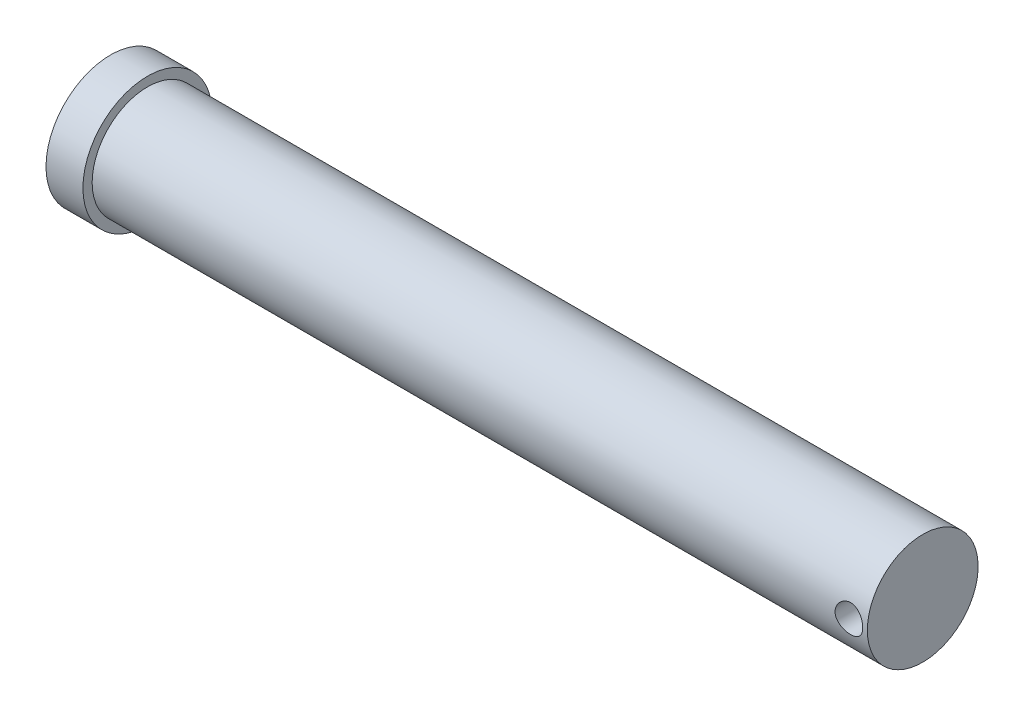
ISO-10303-21;
HEADER;
FILE_DESCRIPTION(('STEP AP214'),'2;1');
FILE_NAME('part.step','',(''),(''),'','','');
FILE_SCHEMA(('AUTOMOTIVE_DESIGN { 1 0 10303 214 1 1 1 1 }'));
ENDSEC;
DATA;
#1=APPLICATION_CONTEXT('core data for automotive mechanical design processes');
#2=APPLICATION_PROTOCOL_DEFINITION('international standard','automotive_design',2000,#1);
#3=PRODUCT_CONTEXT('',#1,'mechanical');
#4=PRODUCT('Part','Part','',(#3));
#5=PRODUCT_RELATED_PRODUCT_CATEGORY('part','',(#4));
#6=PRODUCT_DEFINITION_FORMATION('','',#4);
#7=PRODUCT_DEFINITION_CONTEXT('part definition',#1,'design');
#8=PRODUCT_DEFINITION('design','',#6,#7);
#9=PRODUCT_DEFINITION_SHAPE('','',#8);
#10=(LENGTH_UNIT() NAMED_UNIT(*) SI_UNIT(.MILLI.,.METRE.));
#11=(NAMED_UNIT(*) PLANE_ANGLE_UNIT() SI_UNIT($,.RADIAN.));
#12=(NAMED_UNIT(*) SI_UNIT($,.STERADIAN.) SOLID_ANGLE_UNIT());
#13=UNCERTAINTY_MEASURE_WITH_UNIT(LENGTH_MEASURE(1.E-05),#10,'distance_accuracy_value','');
#14=(GEOMETRIC_REPRESENTATION_CONTEXT(3) GLOBAL_UNCERTAINTY_ASSIGNED_CONTEXT((#13)) GLOBAL_UNIT_ASSIGNED_CONTEXT((#10,
#11,#12)) REPRESENTATION_CONTEXT('',''));
#15=CARTESIAN_POINT('',(0.,0.,0.));
#16=DIRECTION('',(0.,0.,1.));
#17=DIRECTION('',(1.,0.,0.));
#18=AXIS2_PLACEMENT_3D('',#15,#16,#17);
#19=CARTESIAN_POINT('',(0.,0.,0.));
#20=DIRECTION('',(1.,0.,0.));
#21=DIRECTION('',(0.,0.,-1.));
#22=AXIS2_PLACEMENT_3D('',#19,#20,#21);
#23=PLANE('',#22);
#24=CARTESIAN_POINT('',(0.,0.,0.));
#25=DIRECTION('',(-1.,0.,0.));
#26=DIRECTION('',(0.,0.,1.));
#27=AXIS2_PLACEMENT_3D('',#24,#25,#26);
#28=CIRCLE('',#27,35.);
#29=CARTESIAN_POINT('',(0.,0.,35.));
#30=VERTEX_POINT('',#29);
#31=EDGE_CURVE('E45',#30,#30,#28,.T.);
#32=ORIENTED_EDGE('',*,*,#31,.T.);
#33=EDGE_LOOP('',(#32));
#34=FACE_BOUND('',#33,.T.);
#35=ADVANCED_FACE('F30',(#34),#23,.F.);
#36=CARTESIAN_POINT('',(0.,0.,0.));
#37=DIRECTION('',(-1.,0.,0.));
#38=DIRECTION('',(0.,0.,1.));
#39=AXIS2_PLACEMENT_3D('',#36,#37,#38);
#40=CYLINDRICAL_SURFACE('',#39,35.);
#41=ORIENTED_EDGE('',*,*,#31,.F.);
#42=EDGE_LOOP('',(#41));
#43=FACE_BOUND('',#42,.T.);
#44=CARTESIAN_POINT('',(20.,0.,0.));
#45=DIRECTION('',(-1.,0.,0.));
#46=DIRECTION('',(0.,0.,1.));
#47=AXIS2_PLACEMENT_3D('',#44,#45,#46);
#48=CIRCLE('',#47,35.);
#49=CARTESIAN_POINT('',(20.,0.,35.));
#50=VERTEX_POINT('',#49);
#51=EDGE_CURVE('E49',#50,#50,#48,.T.);
#52=ORIENTED_EDGE('',*,*,#51,.T.);
#53=EDGE_LOOP('',(#52));
#54=FACE_BOUND('',#53,.T.);
#55=ADVANCED_FACE('F73',(#43,#54),#40,.T.);
#56=CARTESIAN_POINT('',(20.,35.,0.));
#57=DIRECTION('',(-1.,0.,0.));
#58=DIRECTION('',(0.,0.,1.));
#59=AXIS2_PLACEMENT_3D('',#56,#57,#58);
#60=PLANE('',#59);
#61=ORIENTED_EDGE('',*,*,#51,.F.);
#62=EDGE_LOOP('',(#61));
#63=FACE_BOUND('',#62,.T.);
#64=CARTESIAN_POINT('',(20.,0.,0.));
#65=DIRECTION('',(-1.,0.,0.));
#66=DIRECTION('',(0.,0.,1.));
#67=AXIS2_PLACEMENT_3D('',#64,#65,#66);
#68=CIRCLE('',#67,30.);
#69=CARTESIAN_POINT('',(20.,0.,30.));
#70=VERTEX_POINT('',#69);
#71=EDGE_CURVE('E84',#70,#70,#68,.T.);
#72=ORIENTED_EDGE('',*,*,#71,.T.);
#73=EDGE_LOOP('',(#72));
#74=FACE_BOUND('',#73,.T.);
#75=ADVANCED_FACE('F70',(#63,#74),#60,.F.);
#76=CARTESIAN_POINT('',(0.,0.,0.));
#77=DIRECTION('',(-1.,0.,0.));
#78=DIRECTION('',(0.,0.,1.));
#79=AXIS2_PLACEMENT_3D('',#76,#77,#78);
#80=CYLINDRICAL_SURFACE('',#79,30.);
#81=CARTESIAN_POINT('',(437.5,0.,-30.));
#82=CARTESIAN_POINT('',(437.500006186217,0.207256734254574,-30.0000037453459));
#83=CARTESIAN_POINT('',(437.491407656385,0.414445772619032,-29.9978490421554));
#84=CARTESIAN_POINT('',(437.457100172479,0.827372926875369,-29.9892986338407));
#85=CARTESIAN_POINT('',(437.431389266198,1.0331108745179,-29.9829024448411));
#86=CARTESIAN_POINT('',(437.36305535088,1.44164335288554,-29.9660390935064));
#87=CARTESIAN_POINT('',(437.320427095302,1.6444369502421,-29.9555706682773));
#88=CARTESIAN_POINT('',(437.218595090545,2.04566249050755,-29.9308482104685));
#89=CARTESIAN_POINT('',(437.159385232191,2.2440927967297,-29.9165927827403));
#90=CARTESIAN_POINT('',(437.024978510783,2.63482361033414,-29.8847130121074));
#91=CARTESIAN_POINT('',(436.949807291118,2.82713338772061,-29.8670940775137));
#92=CARTESIAN_POINT('',(436.783968260348,3.20473275040713,-29.8289408904844));
#93=CARTESIAN_POINT('',(436.693294723878,3.39001971101988,-29.8084055614329));
#94=CARTESIAN_POINT('',(436.497171832667,3.75222027556639,-29.7649811811595));
#95=CARTESIAN_POINT('',(436.391727896133,3.92913691827915,-29.742092993849));
#96=CARTESIAN_POINT('',(436.166735936979,4.27360568159023,-29.6945540671174));
#97=CARTESIAN_POINT('',(436.047182537647,4.44115419618484,-29.6699026572012));
#98=CARTESIAN_POINT('',(435.792523081933,4.76869838853698,-29.619039181262));
#99=CARTESIAN_POINT('',(435.657174907785,4.92850273427093,-29.5928069564233));
#100=CARTESIAN_POINT('',(435.373571351917,5.23627158512015,-29.5399027992388));
#101=CARTESIAN_POINT('',(435.225310108959,5.38423065457484,-29.5132306717209));
#102=CARTESIAN_POINT('',(434.916888160703,5.66727667516601,-29.4601886439759));
#103=CARTESIAN_POINT('',(434.756726097413,5.80236215327963,-29.4338187786372));
#104=CARTESIAN_POINT('',(434.425632772002,6.05867850940972,-29.3821290110363));
#105=CARTESIAN_POINT('',(434.254706399365,6.1799156083703,-29.3568086406046));
#106=CARTESIAN_POINT('',(433.900431237845,6.40951409930151,-29.3075439341613));
#107=CARTESIAN_POINT('',(433.716932176899,6.51764960185278,-29.2836266449605));
#108=CARTESIAN_POINT('',(433.341230118986,6.71799715274033,-29.2383150093389));
#109=CARTESIAN_POINT('',(433.149030545994,6.81021539751506,-29.2169196821753));
#110=CARTESIAN_POINT('',(432.757145068967,6.97807998690057,-29.1772830300449));
#111=CARTESIAN_POINT('',(432.557457135497,7.05372180053084,-29.1590425677112));
#112=CARTESIAN_POINT('',(432.152161449931,7.1877490781954,-29.1262944152227));
#113=CARTESIAN_POINT('',(431.946556194448,7.24614170611684,-29.111785175751));
#114=CARTESIAN_POINT('',(431.534958657447,7.34423429783448,-29.087191868454));
#115=CARTESIAN_POINT('',(431.329053396646,7.3842790777465,-29.0770264361312));
#116=CARTESIAN_POINT('',(430.914524296797,7.44698381998103,-29.0610302983691));
#117=CARTESIAN_POINT('',(430.705901540208,7.46965050140471,-29.0551979176174));
#118=CARTESIAN_POINT('',(430.287403528923,7.4974248655388,-29.0480434288025));
#119=CARTESIAN_POINT('',(430.077528217797,7.50253175108483,-29.0467215255021));
#120=CARTESIAN_POINT('',(429.658110384037,7.49513850303138,-29.0486301556068));
#121=CARTESIAN_POINT('',(429.448567856817,7.48263861425262,-29.0518606257116));
#122=CARTESIAN_POINT('',(429.036489209476,7.44066443989573,-29.0626386537169));
#123=CARTESIAN_POINT('',(428.833907059313,7.4116127135399,-29.0700787116682));
#124=CARTESIAN_POINT('',(428.431905166734,7.33708950806225,-29.0889771849314));
#125=CARTESIAN_POINT('',(428.232486535232,7.29161238858818,-29.1004369805509));
#126=CARTESIAN_POINT('',(427.838319690164,7.18462456321622,-29.1270356051467));
#127=CARTESIAN_POINT('',(427.643570038699,7.12311886472078,-29.1421732850352));
#128=CARTESIAN_POINT('',(427.259908488116,6.98451980658927,-29.1757016001342));
#129=CARTESIAN_POINT('',(427.070998807608,6.90742060486374,-29.1940934541936));
#130=CARTESIAN_POINT('',(426.69851839304,6.73739848582151,-29.2338015327733));
#131=CARTESIAN_POINT('',(426.515017414975,6.64432902465888,-29.2551444484012));
#132=CARTESIAN_POINT('',(426.156419006921,6.44353389820847,-29.3000247863839));
#133=CARTESIAN_POINT('',(425.981324498638,6.33580318651136,-29.3235629634671));
#134=CARTESIAN_POINT('',(425.640714884194,6.10645448231138,-29.3721798477543));
#135=CARTESIAN_POINT('',(425.475199544114,5.98483682913734,-29.3972585173093));
#136=CARTESIAN_POINT('',(425.154773921606,5.72851464458563,-29.4482799478748));
#137=CARTESIAN_POINT('',(424.999863844413,5.59380986006436,-29.4742227255933));
#138=CARTESIAN_POINT('',(424.697330574703,5.30812720402336,-29.5270296746379));
#139=CARTESIAN_POINT('',(424.550044476872,5.15679305825285,-29.5538989083984));
#140=CARTESIAN_POINT('',(424.268755446213,4.8422451377086,-29.6070614891839));
#141=CARTESIAN_POINT('',(424.134748122933,4.67903532063278,-29.633355024301));
#142=CARTESIAN_POINT('',(423.88082948277,4.34169745900449,-29.6846555639648));
#143=CARTESIAN_POINT('',(423.760923905518,4.16756501268236,-29.7096620423464));
#144=CARTESIAN_POINT('',(423.536173056712,3.80966849400542,-29.7576713903058));
#145=CARTESIAN_POINT('',(423.431321967214,3.62590818010508,-29.7806750325377));
#146=CARTESIAN_POINT('',(423.237034272838,3.24921184124929,-29.8241295151946));
#147=CARTESIAN_POINT('',(423.147658542865,3.05624322556215,-29.8445701905708));
#148=CARTESIAN_POINT('',(422.985552498738,2.6632116427314,-29.8822063507743));
#149=CARTESIAN_POINT('',(422.912816015972,2.46315133653782,-29.8994030378182));
#150=CARTESIAN_POINT('',(422.784544100766,2.05730133669797,-29.9300671893901));
#151=CARTESIAN_POINT('',(422.729009232108,1.85151145550624,-29.9435345316876));
#152=CARTESIAN_POINT('',(422.635622134414,1.43573434643275,-29.9663479171876));
#153=CARTESIAN_POINT('',(422.597769469432,1.22574722216535,-29.9756940619961));
#154=CARTESIAN_POINT('',(422.540819163691,0.808578683807361,-29.9898089145492));
#155=CARTESIAN_POINT('',(422.521266127366,0.601463095698461,-29.9946886976466));
#156=CARTESIAN_POINT('',(422.499432162322,0.186267995157771,-30.0001400772457));
#157=CARTESIAN_POINT('',(422.497150960436,-0.0218115019769025,-30.000711741884));
#158=CARTESIAN_POINT('',(422.50987953381,-0.437389325214032,-29.9975310207239));
#159=CARTESIAN_POINT('',(422.524887864681,-0.644887698412749,-29.9937789961322));
#160=CARTESIAN_POINT('',(422.572063941794,-1.05780268491358,-29.9820565166686));
#161=CARTESIAN_POINT('',(422.604231620946,-1.26321930635195,-29.9740860782903));
#162=CARTESIAN_POINT('',(422.684842366611,-1.66742320422338,-29.9542990466074));
#163=CARTESIAN_POINT('',(422.733033584068,-1.86626371494321,-29.9425420528386));
#164=CARTESIAN_POINT('',(422.845432070167,-2.25918742632009,-29.9154620308896));
#165=CARTESIAN_POINT('',(422.909644760804,-2.45326899198191,-29.9001377955995));
#166=CARTESIAN_POINT('',(423.05356225007,-2.83525089394273,-29.8663374011303));
#167=CARTESIAN_POINT('',(423.133262697368,-3.02315294909719,-29.8478621274231));
#168=CARTESIAN_POINT('',(423.307610064188,-3.39167896910059,-29.8082350586212));
#169=CARTESIAN_POINT('',(423.402262583514,-3.57230017520982,-29.7870822613409));
#170=CARTESIAN_POINT('',(423.607595070583,-3.92811410360475,-29.7422701230095));
#171=CARTESIAN_POINT('',(423.718525064136,-4.10315786453241,-29.7185735994032));
#172=CARTESIAN_POINT('',(423.954405866344,-4.44338343365204,-29.6696123625192));
#173=CARTESIAN_POINT('',(424.07936153279,-4.60856179442648,-29.6443471072734));
#174=CARTESIAN_POINT('',(424.342420940197,-4.92794065130355,-29.5929310301235));
#175=CARTESIAN_POINT('',(424.480524460526,-5.08214133154532,-29.5667802230845));
#176=CARTESIAN_POINT('',(424.76898239741,-5.37858986672454,-29.5142920657744));
#177=CARTESIAN_POINT('',(424.919336952682,-5.52083758628274,-29.4879547133943));
#178=CARTESIAN_POINT('',(425.235205576479,-5.79583124003958,-29.4351563606738));
#179=CARTESIAN_POINT('',(425.401002867936,-5.92825459803295,-29.4087084526847));
#180=CARTESIAN_POINT('',(425.743293990939,-6.17862451598173,-29.3571275246933));
#181=CARTESIAN_POINT('',(425.919784122681,-6.2965760410501,-29.3319940554304));
#182=CARTESIAN_POINT('',(426.282397387657,-6.51724566861916,-29.2837544538572));
#183=CARTESIAN_POINT('',(426.468523885388,-6.61995840151208,-29.2606490373261));
#184=CARTESIAN_POINT('',(426.849007741884,-6.80928641924754,-29.2171705487862));
#185=CARTESIAN_POINT('',(427.043361767825,-6.89590814708463,-29.1967963840713));
#186=CARTESIAN_POINT('',(427.437897915295,-7.05197723932849,-29.1594928518965));
#187=CARTESIAN_POINT('',(427.638041174236,-7.12151832737373,-29.142544780169));
#188=CARTESIAN_POINT('',(428.043683954084,-7.24345651216679,-29.1124764442986));
#189=CARTESIAN_POINT('',(428.249181379846,-7.29586020933087,-29.0993547066657));
#190=CARTESIAN_POINT('',(428.664097517061,-7.38310953761381,-29.0773403452908));
#191=CARTESIAN_POINT('',(428.873516262,-7.41795501871784,-29.0684477576821));
#192=CARTESIAN_POINT('',(429.294693502206,-7.46977632397466,-29.0551744235845));
#193=CARTESIAN_POINT('',(429.506451941057,-7.48675257805307,-29.0507935685455));
#194=CARTESIAN_POINT('',(429.924548037896,-7.50245275501608,-29.0467427280977));
#195=CARTESIAN_POINT('',(430.130865291879,-7.50169050219219,-29.0469401256905));
#196=CARTESIAN_POINT('',(430.542757585411,-7.48317627143568,-29.0517153474306));
#197=CARTESIAN_POINT('',(430.748332344452,-7.46541843430737,-29.0562946822425));
#198=CARTESIAN_POINT('',(431.157102212016,-7.41306667528967,-29.0696950370366));
#199=CARTESIAN_POINT('',(431.360298223325,-7.37847936764756,-29.0785143906083));
#200=CARTESIAN_POINT('',(431.763027411306,-7.29274542738181,-29.1001342961677));
#201=CARTESIAN_POINT('',(431.962559195749,-7.24159263281379,-29.1129363295422));
#202=CARTESIAN_POINT('',(432.355248099114,-7.12352281554545,-29.1420502241293));
#203=CARTESIAN_POINT('',(432.548437627675,-7.05670785633591,-29.1583393045388));
#204=CARTESIAN_POINT('',(432.928538990651,-6.90762983393257,-29.1940151713161));
#205=CARTESIAN_POINT('',(433.115448654799,-6.82536149362097,-29.2134030155311));
#206=CARTESIAN_POINT('',(433.481700975957,-6.64600134575065,-29.2547283332099));
#207=CARTESIAN_POINT('',(433.66104416923,-6.54891059096672,-29.2766656255706));
#208=CARTESIAN_POINT('',(434.011053726098,-6.34057791264133,-29.3224903932774));
#209=CARTESIAN_POINT('',(434.181719851362,-6.2293356006946,-29.3463779221434));
#210=CARTESIAN_POINT('',(434.517676511659,-5.99034243964054,-29.3961065190916));
#211=CARTESIAN_POINT('',(434.682708134733,-5.86223474325165,-29.42198241748));
#212=CARTESIAN_POINT('',(435.001403053256,-5.59280739993016,-29.4743842744133));
#213=CARTESIAN_POINT('',(435.155069946792,-5.45149196693633,-29.5009100236431));
#214=CARTESIAN_POINT('',(435.450186022067,-5.15645532971094,-29.5539073425417));
#215=CARTESIAN_POINT('',(435.591628075764,-5.00272698747202,-29.580378871931));
#216=CARTESIAN_POINT('',(435.861210696173,-4.68398990056899,-29.6325210396486));
#217=CARTESIAN_POINT('',(435.989356069046,-4.51898526780471,-29.6581919649966));
#218=CARTESIAN_POINT('',(436.233778989682,-4.17555233782097,-29.7085076706245));
#219=CARTESIAN_POINT('',(436.349792570839,-3.99693193174419,-29.7331246154161));
#220=CARTESIAN_POINT('',(436.566283371818,-3.63032066972452,-29.7801093561847));
#221=CARTESIAN_POINT('',(436.666766303198,-3.4423332923778,-29.8024779779427));
#222=CARTESIAN_POINT('',(436.851436858964,-3.0582961610557,-29.8443309638024));
#223=CARTESIAN_POINT('',(436.935631507769,-2.86224992693639,-29.8638165703651));
#224=CARTESIAN_POINT('',(437.087082944362,-2.46348752288635,-29.8993536986122));
#225=CARTESIAN_POINT('',(437.154342287269,-2.26077236435612,-29.9154057382819));
#226=CARTESIAN_POINT('',(437.307791067383,-1.72222038090993,-29.9523811960306));
#227=CARTESIAN_POINT('',(437.379744222302,-1.38198934082179,-29.9701268439889));
#228=CARTESIAN_POINT('',(437.475841710173,-0.694441878056045,-29.9939326700618));
#229=CARTESIAN_POINT('',(437.499989638953,-0.347125990274136,-29.9999937270705));
#230=CARTESIAN_POINT('',(437.5,0.,-30.));
#231=B_SPLINE_CURVE_WITH_KNOTS('',3,(#81,#82,#83,#84,#85,#86,#87,#88,#89,#90,#91,#92,#93,#94,
#95,#96,#97,#98,#99,#100,#101,#102,#103,#104,#105,#106,#107,#108,#109,#110,#111,#112,#113,#114,
#115,#116,#117,#118,#119,#120,#121,#122,#123,#124,#125,#126,#127,#128,#129,#130,#131,#132,#133,
#134,#135,#136,#137,#138,#139,#140,#141,#142,#143,#144,#145,#146,#147,#148,#149,#150,#151,#152,
#153,#154,#155,#156,#157,#158,#159,#160,#161,#162,#163,#164,#165,#166,#167,#168,#169,#170,#171,
#172,#173,#174,#175,#176,#177,#178,#179,#180,#181,#182,#183,#184,#185,#186,#187,#188,#189,#190,
#191,#192,#193,#194,#195,#196,#197,#198,#199,#200,#201,#202,#203,#204,#205,#206,#207,#208,#209,
#210,#211,#212,#213,#214,#215,#216,#217,#218,#219,#220,#221,#222,#223,#224,#225,#226,#227,#228,
#229,#230),.UNSPECIFIED.,.T.,.F.,(4,2,2,2,2,2,2,2,2,2,2,2,2,2,2,2,2,2,2,2,2,2,2,2,2,2,2,2,2,2,2,
2,2,2,2,2,2,2,2,2,2,2,2,2,2,2,2,2,2,2,2,2,2,2,2,2,2,2,2,2,2,2,2,2,2,2,2,2,2,2,2,2,2,2,4),(0.,
0.621464317010415,1.24299954382043,1.86472767684075,2.48668517567918,3.10765090273784,
3.72884646419193,4.34981474719269,4.9710204322486,5.60345785394206,6.23618384989137,
6.86898215694612,7.50149507214969,8.14370490718985,8.78566416935039,9.42779868557203,
10.0696661359822,10.6989188565581,11.3279281587942,11.9569660158719,12.5859951263177,
13.1996422302775,13.813500256537,14.4271667401151,15.0410635604956,15.6609283810619,
16.2810071015709,16.9010706736347,17.5211462419403,18.1590318968173,18.7967059344353,
19.4346386236679,20.072324110567,20.7124637031903,21.3523655930574,21.9922884534341,
22.6321955359513,23.2557181786969,23.8792309598844,24.502691655776,25.1261499140133,
25.7402389224971,26.3545360338667,26.9686608054559,27.5830161248213,28.2080518295538,
28.8333046873218,29.4585470546531,30.0837965025262,30.7245311303908,31.3650453114752,
32.0057846536418,32.6462668819265,33.2831519874563,33.9197915088559,34.5564364695181,
35.1930661124366,35.811278334809,36.4297037614805,37.0478863332833,37.666299118085,
38.2807888234883,38.8954887514427,39.5101450400985,40.1248182023237,40.7556352414597,
41.386251700531,42.0172334122504,42.6479862516883,43.2904290553219,43.9326350288529,
44.5745634267957,45.2163949154786,46.2573388715186,47.2982045265631),.UNSPECIFIED.);
#232=CARTESIAN_POINT('',(437.5,0.,-30.));
#233=VERTEX_POINT('',#232);
#234=EDGE_CURVE('E10',#233,#233,#231,.T.);
#235=ORIENTED_EDGE('',*,*,#234,.T.);
#236=EDGE_LOOP('',(#235));
#237=FACE_BOUND('',#236,.T.);
#238=CARTESIAN_POINT('',(437.5,0.,30.));
#239=CARTESIAN_POINT('',(437.500006186217,-0.207256734254574,30.0000037453459));
#240=CARTESIAN_POINT('',(437.491407656385,-0.414445772619032,29.9978490421554));
#241=CARTESIAN_POINT('',(437.457100172479,-0.827372926875369,29.9892986338407));
#242=CARTESIAN_POINT('',(437.431389266198,-1.0331108745179,29.9829024448411));
#243=CARTESIAN_POINT('',(437.36305535088,-1.44164335288554,29.9660390935064));
#244=CARTESIAN_POINT('',(437.320427095302,-1.6444369502421,29.9555706682773));
#245=CARTESIAN_POINT('',(437.218595090545,-2.04566249050755,29.9308482104685));
#246=CARTESIAN_POINT('',(437.159385232191,-2.2440927967297,29.9165927827403));
#247=CARTESIAN_POINT('',(437.024978510783,-2.63482361033414,29.8847130121074));
#248=CARTESIAN_POINT('',(436.949807291118,-2.82713338772061,29.8670940775137));
#249=CARTESIAN_POINT('',(436.783968260348,-3.20473275040713,29.8289408904844));
#250=CARTESIAN_POINT('',(436.693294723878,-3.39001971101988,29.8084055614329));
#251=CARTESIAN_POINT('',(436.497171832667,-3.75222027556639,29.7649811811595));
#252=CARTESIAN_POINT('',(436.391727896133,-3.92913691827915,29.742092993849));
#253=CARTESIAN_POINT('',(436.166735936979,-4.27360568159023,29.6945540671174));
#254=CARTESIAN_POINT('',(436.047182537647,-4.44115419618484,29.6699026572012));
#255=CARTESIAN_POINT('',(435.792523081933,-4.76869838853698,29.619039181262));
#256=CARTESIAN_POINT('',(435.657174907785,-4.92850273427093,29.5928069564233));
#257=CARTESIAN_POINT('',(435.373571351917,-5.23627158512015,29.5399027992388));
#258=CARTESIAN_POINT('',(435.225310108959,-5.38423065457484,29.5132306717209));
#259=CARTESIAN_POINT('',(434.916888160703,-5.66727667516601,29.4601886439759));
#260=CARTESIAN_POINT('',(434.756726097413,-5.80236215327963,29.4338187786372));
#261=CARTESIAN_POINT('',(434.425632772002,-6.05867850940972,29.3821290110363));
#262=CARTESIAN_POINT('',(434.254706399365,-6.1799156083703,29.3568086406046));
#263=CARTESIAN_POINT('',(433.900431237845,-6.40951409930151,29.3075439341613));
#264=CARTESIAN_POINT('',(433.716932176899,-6.51764960185278,29.2836266449605));
#265=CARTESIAN_POINT('',(433.341230118986,-6.71799715274033,29.2383150093389));
#266=CARTESIAN_POINT('',(433.149030545994,-6.81021539751506,29.2169196821753));
#267=CARTESIAN_POINT('',(432.757145068967,-6.97807998690057,29.1772830300449));
#268=CARTESIAN_POINT('',(432.557457135497,-7.05372180053084,29.1590425677112));
#269=CARTESIAN_POINT('',(432.152161449931,-7.1877490781954,29.1262944152227));
#270=CARTESIAN_POINT('',(431.946556194448,-7.24614170611684,29.111785175751));
#271=CARTESIAN_POINT('',(431.534958657447,-7.34423429783448,29.087191868454));
#272=CARTESIAN_POINT('',(431.329053396646,-7.3842790777465,29.0770264361312));
#273=CARTESIAN_POINT('',(430.914524296797,-7.44698381998103,29.0610302983691));
#274=CARTESIAN_POINT('',(430.705901540208,-7.46965050140471,29.0551979176174));
#275=CARTESIAN_POINT('',(430.287403528923,-7.4974248655388,29.0480434288025));
#276=CARTESIAN_POINT('',(430.077528217797,-7.50253175108483,29.0467215255021));
#277=CARTESIAN_POINT('',(429.658110384037,-7.49513850303138,29.0486301556068));
#278=CARTESIAN_POINT('',(429.448567856817,-7.48263861425262,29.0518606257116));
#279=CARTESIAN_POINT('',(429.036489209476,-7.44066443989573,29.0626386537169));
#280=CARTESIAN_POINT('',(428.833907059313,-7.4116127135399,29.0700787116682));
#281=CARTESIAN_POINT('',(428.431905166734,-7.33708950806225,29.0889771849314));
#282=CARTESIAN_POINT('',(428.232486535232,-7.29161238858818,29.1004369805509));
#283=CARTESIAN_POINT('',(427.838319690164,-7.18462456321622,29.1270356051467));
#284=CARTESIAN_POINT('',(427.643570038699,-7.12311886472078,29.1421732850352));
#285=CARTESIAN_POINT('',(427.259908488116,-6.98451980658927,29.1757016001342));
#286=CARTESIAN_POINT('',(427.070998807608,-6.90742060486374,29.1940934541936));
#287=CARTESIAN_POINT('',(426.69851839304,-6.73739848582151,29.2338015327733));
#288=CARTESIAN_POINT('',(426.515017414975,-6.64432902465888,29.2551444484012));
#289=CARTESIAN_POINT('',(426.156419006921,-6.44353389820847,29.3000247863839));
#290=CARTESIAN_POINT('',(425.981324498638,-6.33580318651136,29.3235629634671));
#291=CARTESIAN_POINT('',(425.640714884194,-6.10645448231138,29.3721798477543));
#292=CARTESIAN_POINT('',(425.475199544114,-5.98483682913734,29.3972585173093));
#293=CARTESIAN_POINT('',(425.154773921606,-5.72851464458563,29.4482799478748));
#294=CARTESIAN_POINT('',(424.999863844413,-5.59380986006436,29.4742227255933));
#295=CARTESIAN_POINT('',(424.697330574703,-5.30812720402336,29.5270296746379));
#296=CARTESIAN_POINT('',(424.550044476872,-5.15679305825285,29.5538989083984));
#297=CARTESIAN_POINT('',(424.268755446213,-4.8422451377086,29.6070614891839));
#298=CARTESIAN_POINT('',(424.134748122933,-4.67903532063278,29.633355024301));
#299=CARTESIAN_POINT('',(423.88082948277,-4.34169745900449,29.6846555639648));
#300=CARTESIAN_POINT('',(423.760923905518,-4.16756501268236,29.7096620423464));
#301=CARTESIAN_POINT('',(423.536173056712,-3.80966849400542,29.7576713903058));
#302=CARTESIAN_POINT('',(423.431321967214,-3.62590818010508,29.7806750325377));
#303=CARTESIAN_POINT('',(423.237034272838,-3.24921184124929,29.8241295151946));
#304=CARTESIAN_POINT('',(423.147658542865,-3.05624322556215,29.8445701905708));
#305=CARTESIAN_POINT('',(422.985552498738,-2.6632116427314,29.8822063507743));
#306=CARTESIAN_POINT('',(422.912816015972,-2.46315133653782,29.8994030378182));
#307=CARTESIAN_POINT('',(422.784544100766,-2.05730133669797,29.9300671893901));
#308=CARTESIAN_POINT('',(422.729009232108,-1.85151145550624,29.9435345316876));
#309=CARTESIAN_POINT('',(422.635622134414,-1.43573434643275,29.9663479171876));
#310=CARTESIAN_POINT('',(422.597769469432,-1.22574722216535,29.9756940619961));
#311=CARTESIAN_POINT('',(422.540819163691,-0.808578683807361,29.9898089145492));
#312=CARTESIAN_POINT('',(422.521266127366,-0.601463095698461,29.9946886976466));
#313=CARTESIAN_POINT('',(422.499432162322,-0.186267995157771,30.0001400772457));
#314=CARTESIAN_POINT('',(422.497150960436,0.0218115019769025,30.000711741884));
#315=CARTESIAN_POINT('',(422.50987953381,0.437389325214032,29.9975310207239));
#316=CARTESIAN_POINT('',(422.524887864681,0.644887698412749,29.9937789961322));
#317=CARTESIAN_POINT('',(422.572063941794,1.05780268491358,29.9820565166686));
#318=CARTESIAN_POINT('',(422.604231620946,1.26321930635195,29.9740860782903));
#319=CARTESIAN_POINT('',(422.684842366611,1.66742320422338,29.9542990466074));
#320=CARTESIAN_POINT('',(422.733033584068,1.86626371494321,29.9425420528386));
#321=CARTESIAN_POINT('',(422.845432070167,2.25918742632009,29.9154620308896));
#322=CARTESIAN_POINT('',(422.909644760804,2.45326899198191,29.9001377955995));
#323=CARTESIAN_POINT('',(423.05356225007,2.83525089394273,29.8663374011303));
#324=CARTESIAN_POINT('',(423.133262697368,3.02315294909719,29.8478621274231));
#325=CARTESIAN_POINT('',(423.307610064188,3.39167896910059,29.8082350586212));
#326=CARTESIAN_POINT('',(423.402262583514,3.57230017520982,29.7870822613409));
#327=CARTESIAN_POINT('',(423.607595070583,3.92811410360475,29.7422701230095));
#328=CARTESIAN_POINT('',(423.718525064136,4.10315786453241,29.7185735994032));
#329=CARTESIAN_POINT('',(423.954405866344,4.44338343365204,29.6696123625192));
#330=CARTESIAN_POINT('',(424.07936153279,4.60856179442648,29.6443471072734));
#331=CARTESIAN_POINT('',(424.342420940197,4.92794065130355,29.5929310301235));
#332=CARTESIAN_POINT('',(424.480524460526,5.08214133154532,29.5667802230845));
#333=CARTESIAN_POINT('',(424.76898239741,5.37858986672454,29.5142920657744));
#334=CARTESIAN_POINT('',(424.919336952682,5.52083758628274,29.4879547133943));
#335=CARTESIAN_POINT('',(425.235205576479,5.79583124003958,29.4351563606738));
#336=CARTESIAN_POINT('',(425.401002867936,5.92825459803295,29.4087084526847));
#337=CARTESIAN_POINT('',(425.743293990939,6.17862451598173,29.3571275246933));
#338=CARTESIAN_POINT('',(425.919784122681,6.2965760410501,29.3319940554304));
#339=CARTESIAN_POINT('',(426.282397387657,6.51724566861916,29.2837544538572));
#340=CARTESIAN_POINT('',(426.468523885388,6.61995840151208,29.2606490373261));
#341=CARTESIAN_POINT('',(426.849007741884,6.80928641924754,29.2171705487862));
#342=CARTESIAN_POINT('',(427.043361767825,6.89590814708463,29.1967963840713));
#343=CARTESIAN_POINT('',(427.437897915295,7.05197723932849,29.1594928518965));
#344=CARTESIAN_POINT('',(427.638041174236,7.12151832737373,29.142544780169));
#345=CARTESIAN_POINT('',(428.043683954084,7.24345651216679,29.1124764442986));
#346=CARTESIAN_POINT('',(428.249181379846,7.29586020933087,29.0993547066657));
#347=CARTESIAN_POINT('',(428.664097517061,7.38310953761381,29.0773403452908));
#348=CARTESIAN_POINT('',(428.873516262,7.41795501871784,29.0684477576821));
#349=CARTESIAN_POINT('',(429.294693502206,7.46977632397466,29.0551744235845));
#350=CARTESIAN_POINT('',(429.506451941057,7.48675257805307,29.0507935685455));
#351=CARTESIAN_POINT('',(429.924548037896,7.50245275501608,29.0467427280977));
#352=CARTESIAN_POINT('',(430.130865291879,7.50169050219219,29.0469401256905));
#353=CARTESIAN_POINT('',(430.542757585411,7.48317627143568,29.0517153474306));
#354=CARTESIAN_POINT('',(430.748332344452,7.46541843430737,29.0562946822425));
#355=CARTESIAN_POINT('',(431.157102212016,7.41306667528967,29.0696950370366));
#356=CARTESIAN_POINT('',(431.360298223325,7.37847936764756,29.0785143906083));
#357=CARTESIAN_POINT('',(431.763027411306,7.29274542738181,29.1001342961677));
#358=CARTESIAN_POINT('',(431.962559195749,7.24159263281379,29.1129363295422));
#359=CARTESIAN_POINT('',(432.355248099114,7.12352281554545,29.1420502241293));
#360=CARTESIAN_POINT('',(432.548437627675,7.05670785633591,29.1583393045388));
#361=CARTESIAN_POINT('',(432.928538990651,6.90762983393257,29.1940151713161));
#362=CARTESIAN_POINT('',(433.115448654799,6.82536149362097,29.2134030155311));
#363=CARTESIAN_POINT('',(433.481700975957,6.64600134575065,29.2547283332099));
#364=CARTESIAN_POINT('',(433.66104416923,6.54891059096672,29.2766656255706));
#365=CARTESIAN_POINT('',(434.011053726098,6.34057791264133,29.3224903932774));
#366=CARTESIAN_POINT('',(434.181719851362,6.2293356006946,29.3463779221434));
#367=CARTESIAN_POINT('',(434.517676511659,5.99034243964054,29.3961065190916));
#368=CARTESIAN_POINT('',(434.682708134733,5.86223474325165,29.42198241748));
#369=CARTESIAN_POINT('',(435.001403053256,5.59280739993016,29.4743842744133));
#370=CARTESIAN_POINT('',(435.155069946792,5.45149196693633,29.5009100236431));
#371=CARTESIAN_POINT('',(435.450186022067,5.15645532971094,29.5539073425417));
#372=CARTESIAN_POINT('',(435.591628075764,5.00272698747202,29.580378871931));
#373=CARTESIAN_POINT('',(435.861210696173,4.68398990056899,29.6325210396486));
#374=CARTESIAN_POINT('',(435.989356069046,4.51898526780471,29.6581919649966));
#375=CARTESIAN_POINT('',(436.233778989682,4.17555233782097,29.7085076706245));
#376=CARTESIAN_POINT('',(436.349792570839,3.99693193174419,29.7331246154161));
#377=CARTESIAN_POINT('',(436.566283371818,3.63032066972452,29.7801093561847));
#378=CARTESIAN_POINT('',(436.666766303198,3.4423332923778,29.8024779779427));
#379=CARTESIAN_POINT('',(436.851436858964,3.0582961610557,29.8443309638024));
#380=CARTESIAN_POINT('',(436.935631507769,2.86224992693639,29.8638165703651));
#381=CARTESIAN_POINT('',(437.087082944362,2.46348752288635,29.8993536986122));
#382=CARTESIAN_POINT('',(437.154342287269,2.26077236435612,29.9154057382819));
#383=CARTESIAN_POINT('',(437.307791067383,1.72222038090993,29.9523811960306));
#384=CARTESIAN_POINT('',(437.379744222302,1.38198934082179,29.9701268439889));
#385=CARTESIAN_POINT('',(437.475841710173,0.694441878056045,29.9939326700618));
#386=CARTESIAN_POINT('',(437.499989638953,0.347125990274136,29.9999937270705));
#387=CARTESIAN_POINT('',(437.5,0.,30.));
#388=B_SPLINE_CURVE_WITH_KNOTS('',3,(#238,#239,#240,#241,#242,#243,#244,#245,#246,#247,#248,
#249,#250,#251,#252,#253,#254,#255,#256,#257,#258,#259,#260,#261,#262,#263,#264,#265,#266,#267,
#268,#269,#270,#271,#272,#273,#274,#275,#276,#277,#278,#279,#280,#281,#282,#283,#284,#285,#286,
#287,#288,#289,#290,#291,#292,#293,#294,#295,#296,#297,#298,#299,#300,#301,#302,#303,#304,#305,
#306,#307,#308,#309,#310,#311,#312,#313,#314,#315,#316,#317,#318,#319,#320,#321,#322,#323,#324,
#325,#326,#327,#328,#329,#330,#331,#332,#333,#334,#335,#336,#337,#338,#339,#340,#341,#342,#343,
#344,#345,#346,#347,#348,#349,#350,#351,#352,#353,#354,#355,#356,#357,#358,#359,#360,#361,#362,
#363,#364,#365,#366,#367,#368,#369,#370,#371,#372,#373,#374,#375,#376,#377,#378,#379,#380,#381,
#382,#383,#384,#385,#386,#387),.UNSPECIFIED.,.T.,.F.,(4,2,2,2,2,2,2,2,2,2,2,2,2,2,2,2,2,2,2,2,2,
2,2,2,2,2,2,2,2,2,2,2,2,2,2,2,2,2,2,2,2,2,2,2,2,2,2,2,2,2,2,2,2,2,2,2,2,2,2,2,2,2,2,2,2,2,2,2,2,
2,2,2,2,2,4),(0.,0.621464317010415,1.24299954382043,1.86472767684075,2.48668517567918,
3.10765090273784,3.72884646419193,4.34981474719269,4.9710204322486,5.60345785394206,
6.23618384989137,6.86898215694612,7.50149507214969,8.14370490718985,8.78566416935039,
9.42779868557203,10.0696661359822,10.6989188565581,11.3279281587942,11.9569660158719,
12.5859951263177,13.1996422302775,13.813500256537,14.4271667401151,15.0410635604956,
15.6609283810619,16.2810071015709,16.9010706736347,17.5211462419403,18.1590318968173,
18.7967059344353,19.4346386236679,20.072324110567,20.7124637031903,21.3523655930574,
21.9922884534341,22.6321955359513,23.2557181786969,23.8792309598844,24.502691655776,
25.1261499140133,25.7402389224971,26.3545360338667,26.9686608054559,27.5830161248213,
28.2080518295538,28.8333046873218,29.4585470546531,30.0837965025262,30.7245311303908,
31.3650453114752,32.0057846536418,32.6462668819265,33.2831519874563,33.9197915088559,
34.5564364695181,35.1930661124366,35.811278334809,36.4297037614805,37.0478863332833,
37.666299118085,38.2807888234883,38.8954887514427,39.5101450400985,40.1248182023237,
40.7556352414597,41.386251700531,42.0172334122504,42.6479862516883,43.2904290553219,
43.9326350288529,44.5745634267957,45.2163949154786,46.2573388715186,47.2982045265631),.UNSPECIFIED.);
#389=CARTESIAN_POINT('',(437.5,0.,30.));
#390=VERTEX_POINT('',#389);
#391=EDGE_CURVE('E41',#390,#390,#388,.T.);
#392=ORIENTED_EDGE('',*,*,#391,.T.);
#393=EDGE_LOOP('',(#392));
#394=FACE_BOUND('',#393,.T.);
#395=ORIENTED_EDGE('',*,*,#71,.F.);
#396=EDGE_LOOP('',(#395));
#397=FACE_BOUND('',#396,.T.);
#398=CARTESIAN_POINT('',(440.,0.,0.));
#399=DIRECTION('',(-1.,0.,0.));
#400=DIRECTION('',(0.,0.,1.));
#401=AXIS2_PLACEMENT_3D('',#398,#399,#400);
#402=CIRCLE('',#401,30.);
#403=CARTESIAN_POINT('',(440.,0.,30.));
#404=VERTEX_POINT('',#403);
#405=EDGE_CURVE('E86',#404,#404,#402,.T.);
#406=ORIENTED_EDGE('',*,*,#405,.T.);
#407=EDGE_LOOP('',(#406));
#408=FACE_BOUND('',#407,.T.);
#409=ADVANCED_FACE('F55',(#237,#394,#397,#408),#80,.T.);
#410=CARTESIAN_POINT('',(440.,30.,0.));
#411=DIRECTION('',(-1.,0.,0.));
#412=DIRECTION('',(0.,0.,1.));
#413=AXIS2_PLACEMENT_3D('',#410,#411,#412);
#414=PLANE('',#413);
#415=ORIENTED_EDGE('',*,*,#405,.F.);
#416=EDGE_LOOP('',(#415));
#417=FACE_BOUND('',#416,.T.);
#418=ADVANCED_FACE('F62',(#417),#414,.F.);
#419=CARTESIAN_POINT('',(430.,0.,-30.));
#420=DIRECTION('',(0.,0.,1.));
#421=DIRECTION('',(1.,0.,0.));
#422=AXIS2_PLACEMENT_3D('',#419,#420,#421);
#423=CYLINDRICAL_SURFACE('',#422,7.50000000000001);
#424=ORIENTED_EDGE('',*,*,#391,.F.);
#425=EDGE_LOOP('',(#424));
#426=FACE_BOUND('',#425,.T.);
#427=ORIENTED_EDGE('',*,*,#234,.F.);
#428=EDGE_LOOP('',(#427));
#429=FACE_BOUND('',#428,.T.);
#430=ADVANCED_FACE('F59',(#426,#429),#423,.F.);
#431=CLOSED_SHELL('',(#35,#55,#75,#409,#418,#430));
#432=MANIFOLD_SOLID_BREP('B2',#431);
#433=ADVANCED_BREP_SHAPE_REPRESENTATION('',(#18,#432),#14);
#434=SHAPE_DEFINITION_REPRESENTATION(#9,#433);
ENDSEC;
END-ISO-10303-21;
